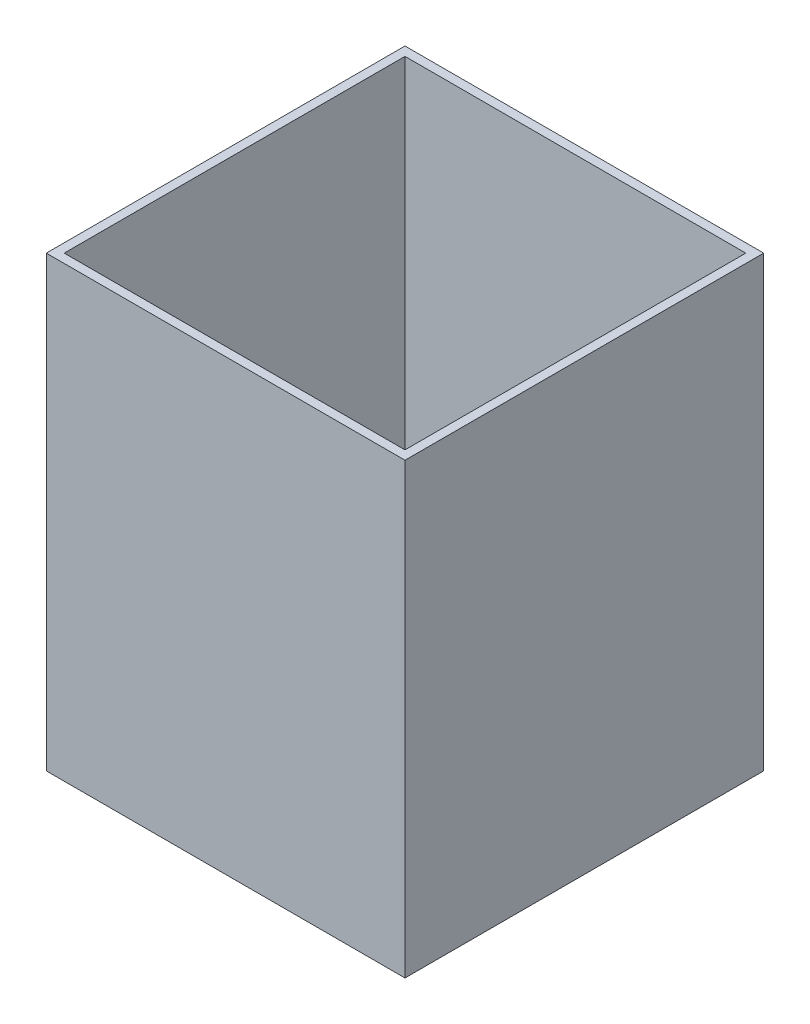
ISO-10303-21;
HEADER;
FILE_DESCRIPTION(('STEP AP214'),'2;1');
FILE_NAME('part.step','',(''),(''),'','','');
FILE_SCHEMA(('AUTOMOTIVE_DESIGN { 1 0 10303 214 1 1 1 1 }'));
ENDSEC;
DATA;
#1=APPLICATION_CONTEXT('core data for automotive mechanical design processes');
#2=APPLICATION_PROTOCOL_DEFINITION('international standard','automotive_design',2000,#1);
#3=PRODUCT_CONTEXT('',#1,'mechanical');
#4=PRODUCT('Part','Part','',(#3));
#5=PRODUCT_RELATED_PRODUCT_CATEGORY('part','',(#4));
#6=PRODUCT_DEFINITION_FORMATION('','',#4);
#7=PRODUCT_DEFINITION_CONTEXT('part definition',#1,'design');
#8=PRODUCT_DEFINITION('design','',#6,#7);
#9=PRODUCT_DEFINITION_SHAPE('','',#8);
#10=(LENGTH_UNIT() NAMED_UNIT(*) SI_UNIT(.MILLI.,.METRE.));
#11=(NAMED_UNIT(*) PLANE_ANGLE_UNIT() SI_UNIT($,.RADIAN.));
#12=(NAMED_UNIT(*) SI_UNIT($,.STERADIAN.) SOLID_ANGLE_UNIT());
#13=UNCERTAINTY_MEASURE_WITH_UNIT(LENGTH_MEASURE(1.E-05),#10,'distance_accuracy_value','');
#14=(GEOMETRIC_REPRESENTATION_CONTEXT(3) GLOBAL_UNCERTAINTY_ASSIGNED_CONTEXT((#13)) GLOBAL_UNIT_ASSIGNED_CONTEXT((#10,
#11,#12)) REPRESENTATION_CONTEXT('',''));
#15=CARTESIAN_POINT('',(0.,0.,0.));
#16=DIRECTION('',(0.,0.,1.));
#17=DIRECTION('',(1.,0.,0.));
#18=AXIS2_PLACEMENT_3D('',#15,#16,#17);
#19=CARTESIAN_POINT('',(0.,50.,0.));
#20=DIRECTION('',(0.,1.,0.));
#21=DIRECTION('',(0.,0.,1.));
#22=AXIS2_PLACEMENT_3D('',#19,#20,#21);
#23=PLANE('',#22);
#24=DIRECTION('',(0.,0.,1.));
#25=VECTOR('',#24,1.);
#26=CARTESIAN_POINT('',(-50.,50.,-50.));
#27=LINE('',#26,#25);
#28=CARTESIAN_POINT('',(-50.,50.,-50.));
#29=VERTEX_POINT('',#28);
#30=CARTESIAN_POINT('',(-50.,50.,30.));
#31=VERTEX_POINT('',#30);
#32=EDGE_CURVE('E136',#29,#31,#27,.T.);
#33=ORIENTED_EDGE('',*,*,#32,.T.);
#34=DIRECTION('',(1.,0.,0.));
#35=VECTOR('',#34,1.);
#36=CARTESIAN_POINT('',(-50.,50.,30.));
#37=LINE('',#36,#35);
#38=CARTESIAN_POINT('',(30.,50.,30.));
#39=VERTEX_POINT('',#38);
#40=EDGE_CURVE('E139',#31,#39,#37,.T.);
#41=ORIENTED_EDGE('',*,*,#40,.T.);
#42=DIRECTION('',(0.,0.,-1.));
#43=VECTOR('',#42,1.);
#44=CARTESIAN_POINT('',(30.,50.,-50.));
#45=LINE('',#44,#43);
#46=CARTESIAN_POINT('',(30.,50.,-50.));
#47=VERTEX_POINT('',#46);
#48=EDGE_CURVE('E142',#39,#47,#45,.T.);
#49=ORIENTED_EDGE('',*,*,#48,.T.);
#50=DIRECTION('',(-1.,0.,0.));
#51=VECTOR('',#50,1.);
#52=CARTESIAN_POINT('',(-50.,50.,-50.));
#53=LINE('',#52,#51);
#54=EDGE_CURVE('E144',#47,#29,#53,.T.);
#55=ORIENTED_EDGE('',*,*,#54,.T.);
#56=EDGE_LOOP('',(#33,#41,#49,#55));
#57=FACE_BOUND('',#56,.T.);
#58=DIRECTION('',(0.,0.,1.));
#59=VECTOR('',#58,1.);
#60=CARTESIAN_POINT('',(-48.,50.,-48.));
#61=LINE('',#60,#59);
#62=CARTESIAN_POINT('',(-48.,50.,-48.));
#63=VERTEX_POINT('',#62);
#64=CARTESIAN_POINT('',(-48.,50.,28.));
#65=VERTEX_POINT('',#64);
#66=EDGE_CURVE('E108',#63,#65,#61,.T.);
#67=ORIENTED_EDGE('',*,*,#66,.F.);
#68=DIRECTION('',(-1.,0.,0.));
#69=VECTOR('',#68,1.);
#70=CARTESIAN_POINT('',(-48.,50.,-48.));
#71=LINE('',#70,#69);
#72=CARTESIAN_POINT('',(28.,50.,-48.));
#73=VERTEX_POINT('',#72);
#74=EDGE_CURVE('E100',#73,#63,#71,.T.);
#75=ORIENTED_EDGE('',*,*,#74,.F.);
#76=DIRECTION('',(0.,0.,-1.));
#77=VECTOR('',#76,1.);
#78=CARTESIAN_POINT('',(28.,50.,-48.));
#79=LINE('',#78,#77);
#80=CARTESIAN_POINT('',(28.,50.,28.));
#81=VERTEX_POINT('',#80);
#82=EDGE_CURVE('E122',#81,#73,#79,.T.);
#83=ORIENTED_EDGE('',*,*,#82,.F.);
#84=DIRECTION('',(1.,0.,0.));
#85=VECTOR('',#84,1.);
#86=CARTESIAN_POINT('',(-48.,50.,28.));
#87=LINE('',#86,#85);
#88=EDGE_CURVE('E120',#65,#81,#87,.T.);
#89=ORIENTED_EDGE('',*,*,#88,.F.);
#90=EDGE_LOOP('',(#67,#75,#83,#89));
#91=FACE_BOUND('',#90,.T.);
#92=ADVANCED_FACE('F35',(#57,#91),#23,.T.);
#93=CARTESIAN_POINT('',(0.,-50.,0.));
#94=DIRECTION('',(0.,1.,0.));
#95=DIRECTION('',(0.,0.,1.));
#96=AXIS2_PLACEMENT_3D('',#93,#94,#95);
#97=PLANE('',#96);
#98=DIRECTION('',(0.,0.,1.));
#99=VECTOR('',#98,1.);
#100=CARTESIAN_POINT('',(-50.,-50.,-50.));
#101=LINE('',#100,#99);
#102=CARTESIAN_POINT('',(-50.,-50.,-50.));
#103=VERTEX_POINT('',#102);
#104=CARTESIAN_POINT('',(-50.,-50.,30.));
#105=VERTEX_POINT('',#104);
#106=EDGE_CURVE('E116',#103,#105,#101,.T.);
#107=ORIENTED_EDGE('',*,*,#106,.F.);
#108=DIRECTION('',(-1.,0.,0.));
#109=VECTOR('',#108,1.);
#110=CARTESIAN_POINT('',(-50.,-50.,-50.));
#111=LINE('',#110,#109);
#112=CARTESIAN_POINT('',(30.,-50.,-50.));
#113=VERTEX_POINT('',#112);
#114=EDGE_CURVE('E140',#113,#103,#111,.T.);
#115=ORIENTED_EDGE('',*,*,#114,.F.);
#116=DIRECTION('',(0.,0.,-1.));
#117=VECTOR('',#116,1.);
#118=CARTESIAN_POINT('',(30.,-50.,-50.));
#119=LINE('',#118,#117);
#120=CARTESIAN_POINT('',(30.,-50.,30.));
#121=VERTEX_POINT('',#120);
#122=EDGE_CURVE('E151',#121,#113,#119,.T.);
#123=ORIENTED_EDGE('',*,*,#122,.F.);
#124=DIRECTION('',(1.,0.,0.));
#125=VECTOR('',#124,1.);
#126=CARTESIAN_POINT('',(-50.,-50.,30.));
#127=LINE('',#126,#125);
#128=EDGE_CURVE('E149',#105,#121,#127,.T.);
#129=ORIENTED_EDGE('',*,*,#128,.F.);
#130=EDGE_LOOP('',(#107,#115,#123,#129));
#131=FACE_BOUND('',#130,.T.);
#132=DIRECTION('',(-1.,0.,0.));
#133=VECTOR('',#132,1.);
#134=CARTESIAN_POINT('',(-48.,-50.,-48.));
#135=LINE('',#134,#133);
#136=CARTESIAN_POINT('',(28.,-50.,-48.));
#137=VERTEX_POINT('',#136);
#138=CARTESIAN_POINT('',(-48.,-50.,-48.));
#139=VERTEX_POINT('',#138);
#140=EDGE_CURVE('E58',#137,#139,#135,.T.);
#141=ORIENTED_EDGE('',*,*,#140,.T.);
#142=DIRECTION('',(0.,0.,1.));
#143=VECTOR('',#142,1.);
#144=CARTESIAN_POINT('',(-48.,-50.,-48.));
#145=LINE('',#144,#143);
#146=CARTESIAN_POINT('',(-48.,-50.,28.));
#147=VERTEX_POINT('',#146);
#148=EDGE_CURVE('E115',#139,#147,#145,.T.);
#149=ORIENTED_EDGE('',*,*,#148,.T.);
#150=DIRECTION('',(1.,0.,0.));
#151=VECTOR('',#150,1.);
#152=CARTESIAN_POINT('',(-48.,-50.,28.));
#153=LINE('',#152,#151);
#154=CARTESIAN_POINT('',(28.,-50.,28.));
#155=VERTEX_POINT('',#154);
#156=EDGE_CURVE('E128',#147,#155,#153,.T.);
#157=ORIENTED_EDGE('',*,*,#156,.T.);
#158=DIRECTION('',(0.,0.,-1.));
#159=VECTOR('',#158,1.);
#160=CARTESIAN_POINT('',(28.,-50.,-48.));
#161=LINE('',#160,#159);
#162=EDGE_CURVE('E109',#155,#137,#161,.T.);
#163=ORIENTED_EDGE('',*,*,#162,.T.);
#164=EDGE_LOOP('',(#141,#149,#157,#163));
#165=FACE_BOUND('',#164,.T.);
#166=ADVANCED_FACE('F169',(#131,#165),#97,.F.);
#167=CARTESIAN_POINT('',(-50.,50.,-50.));
#168=DIRECTION('',(1.,0.,0.));
#169=DIRECTION('',(0.,0.,-1.));
#170=AXIS2_PLACEMENT_3D('',#167,#168,#169);
#171=PLANE('',#170);
#172=ORIENTED_EDGE('',*,*,#106,.T.);
#173=DIRECTION('',(0.,-1.,0.));
#174=VECTOR('',#173,1.);
#175=CARTESIAN_POINT('',(-50.,50.,30.));
#176=LINE('',#175,#174);
#177=EDGE_CURVE('E11',#31,#105,#176,.T.);
#178=ORIENTED_EDGE('',*,*,#177,.F.);
#179=ORIENTED_EDGE('',*,*,#32,.F.);
#180=DIRECTION('',(0.,-1.,0.));
#181=VECTOR('',#180,1.);
#182=CARTESIAN_POINT('',(-50.,50.,-50.));
#183=LINE('',#182,#181);
#184=EDGE_CURVE('E146',#29,#103,#183,.T.);
#185=ORIENTED_EDGE('',*,*,#184,.T.);
#186=EDGE_LOOP('',(#172,#178,#179,#185));
#187=FACE_BOUND('',#186,.T.);
#188=ADVANCED_FACE('F37',(#187),#171,.F.);
#189=CARTESIAN_POINT('',(-50.,50.,30.));
#190=DIRECTION('',(0.,0.,-1.));
#191=DIRECTION('',(-1.,0.,0.));
#192=AXIS2_PLACEMENT_3D('',#189,#190,#191);
#193=PLANE('',#192);
#194=ORIENTED_EDGE('',*,*,#128,.T.);
#195=DIRECTION('',(0.,-1.,0.));
#196=VECTOR('',#195,1.);
#197=CARTESIAN_POINT('',(30.,50.,30.));
#198=LINE('',#197,#196);
#199=EDGE_CURVE('E43',#39,#121,#198,.T.);
#200=ORIENTED_EDGE('',*,*,#199,.F.);
#201=ORIENTED_EDGE('',*,*,#40,.F.);
#202=ORIENTED_EDGE('',*,*,#177,.T.);
#203=EDGE_LOOP('',(#194,#200,#201,#202));
#204=FACE_BOUND('',#203,.T.);
#205=ADVANCED_FACE('F179',(#204),#193,.F.);
#206=CARTESIAN_POINT('',(30.,50.,-50.));
#207=DIRECTION('',(-1.,0.,0.));
#208=DIRECTION('',(0.,0.,1.));
#209=AXIS2_PLACEMENT_3D('',#206,#207,#208);
#210=PLANE('',#209);
#211=ORIENTED_EDGE('',*,*,#122,.T.);
#212=DIRECTION('',(0.,-1.,0.));
#213=VECTOR('',#212,1.);
#214=CARTESIAN_POINT('',(30.,50.,-50.));
#215=LINE('',#214,#213);
#216=EDGE_CURVE('E156',#47,#113,#215,.T.);
#217=ORIENTED_EDGE('',*,*,#216,.F.);
#218=ORIENTED_EDGE('',*,*,#48,.F.);
#219=ORIENTED_EDGE('',*,*,#199,.T.);
#220=EDGE_LOOP('',(#211,#217,#218,#219));
#221=FACE_BOUND('',#220,.T.);
#222=ADVANCED_FACE('F163',(#221),#210,.F.);
#223=CARTESIAN_POINT('',(-50.,50.,-50.));
#224=DIRECTION('',(0.,0.,1.));
#225=DIRECTION('',(1.,0.,0.));
#226=AXIS2_PLACEMENT_3D('',#223,#224,#225);
#227=PLANE('',#226);
#228=ORIENTED_EDGE('',*,*,#114,.T.);
#229=ORIENTED_EDGE('',*,*,#184,.F.);
#230=ORIENTED_EDGE('',*,*,#54,.F.);
#231=ORIENTED_EDGE('',*,*,#216,.T.);
#232=EDGE_LOOP('',(#228,#229,#230,#231));
#233=FACE_BOUND('',#232,.T.);
#234=ADVANCED_FACE('F173',(#233),#227,.F.);
#235=CARTESIAN_POINT('',(-48.,50.,-48.));
#236=DIRECTION('',(0.,0.,1.));
#237=DIRECTION('',(1.,0.,0.));
#238=AXIS2_PLACEMENT_3D('',#235,#236,#237);
#239=PLANE('',#238);
#240=ORIENTED_EDGE('',*,*,#140,.F.);
#241=DIRECTION('',(0.,-1.,0.));
#242=VECTOR('',#241,1.);
#243=CARTESIAN_POINT('',(28.,50.,-48.));
#244=LINE('',#243,#242);
#245=EDGE_CURVE('E104',#73,#137,#244,.T.);
#246=ORIENTED_EDGE('',*,*,#245,.F.);
#247=ORIENTED_EDGE('',*,*,#74,.T.);
#248=DIRECTION('',(0.,-1.,0.));
#249=VECTOR('',#248,1.);
#250=CARTESIAN_POINT('',(-48.,50.,-48.));
#251=LINE('',#250,#249);
#252=EDGE_CURVE('E103',#63,#139,#251,.T.);
#253=ORIENTED_EDGE('',*,*,#252,.T.);
#254=EDGE_LOOP('',(#240,#246,#247,#253));
#255=FACE_BOUND('',#254,.T.);
#256=ADVANCED_FACE('F102',(#255),#239,.T.);
#257=CARTESIAN_POINT('',(-48.,50.,-48.));
#258=DIRECTION('',(1.,0.,0.));
#259=DIRECTION('',(0.,0.,-1.));
#260=AXIS2_PLACEMENT_3D('',#257,#258,#259);
#261=PLANE('',#260);
#262=ORIENTED_EDGE('',*,*,#148,.F.);
#263=ORIENTED_EDGE('',*,*,#252,.F.);
#264=ORIENTED_EDGE('',*,*,#66,.T.);
#265=DIRECTION('',(0.,-1.,0.));
#266=VECTOR('',#265,1.);
#267=CARTESIAN_POINT('',(-48.,50.,28.));
#268=LINE('',#267,#266);
#269=EDGE_CURVE('E117',#65,#147,#268,.T.);
#270=ORIENTED_EDGE('',*,*,#269,.T.);
#271=EDGE_LOOP('',(#262,#263,#264,#270));
#272=FACE_BOUND('',#271,.T.);
#273=ADVANCED_FACE('F112',(#272),#261,.T.);
#274=CARTESIAN_POINT('',(-48.,50.,28.));
#275=DIRECTION('',(0.,0.,-1.));
#276=DIRECTION('',(-1.,0.,0.));
#277=AXIS2_PLACEMENT_3D('',#274,#275,#276);
#278=PLANE('',#277);
#279=ORIENTED_EDGE('',*,*,#156,.F.);
#280=ORIENTED_EDGE('',*,*,#269,.F.);
#281=ORIENTED_EDGE('',*,*,#88,.T.);
#282=DIRECTION('',(0.,-1.,0.));
#283=VECTOR('',#282,1.);
#284=CARTESIAN_POINT('',(28.,50.,28.));
#285=LINE('',#284,#283);
#286=EDGE_CURVE('E50',#81,#155,#285,.T.);
#287=ORIENTED_EDGE('',*,*,#286,.T.);
#288=EDGE_LOOP('',(#279,#280,#281,#287));
#289=FACE_BOUND('',#288,.T.);
#290=ADVANCED_FACE('F202',(#289),#278,.T.);
#291=CARTESIAN_POINT('',(28.,50.,-48.));
#292=DIRECTION('',(-1.,0.,0.));
#293=DIRECTION('',(0.,0.,1.));
#294=AXIS2_PLACEMENT_3D('',#291,#292,#293);
#295=PLANE('',#294);
#296=ORIENTED_EDGE('',*,*,#162,.F.);
#297=ORIENTED_EDGE('',*,*,#286,.F.);
#298=ORIENTED_EDGE('',*,*,#82,.T.);
#299=ORIENTED_EDGE('',*,*,#245,.T.);
#300=EDGE_LOOP('',(#296,#297,#298,#299));
#301=FACE_BOUND('',#300,.T.);
#302=ADVANCED_FACE('F206',(#301),#295,.T.);
#303=CLOSED_SHELL('',(#92,#166,#188,#205,#222,#234,#256,#273,#290,#302));
#304=MANIFOLD_SOLID_BREP('B2',#303);
#305=ADVANCED_BREP_SHAPE_REPRESENTATION('',(#18,#304),#14);
#306=SHAPE_DEFINITION_REPRESENTATION(#9,#305);
ENDSEC;
END-ISO-10303-21;
